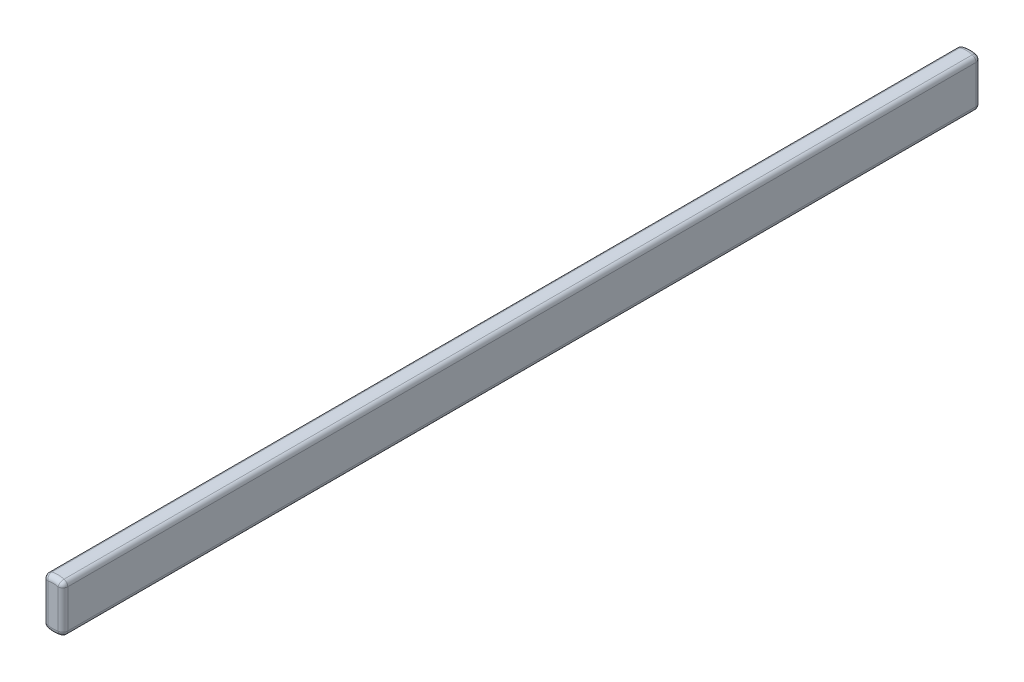
ISO-10303-21;
HEADER;
FILE_DESCRIPTION(('STEP AP214'),'2;1');
FILE_NAME('part.step','',(''),(''),'','','');
FILE_SCHEMA(('AUTOMOTIVE_DESIGN { 1 0 10303 214 1 1 1 1 }'));
ENDSEC;
DATA;
#1=APPLICATION_CONTEXT('core data for automotive mechanical design processes');
#2=APPLICATION_PROTOCOL_DEFINITION('international standard','automotive_design',2000,#1);
#3=PRODUCT_CONTEXT('',#1,'mechanical');
#4=PRODUCT('Part','Part','',(#3));
#5=PRODUCT_RELATED_PRODUCT_CATEGORY('part','',(#4));
#6=PRODUCT_DEFINITION_FORMATION('','',#4);
#7=PRODUCT_DEFINITION_CONTEXT('part definition',#1,'design');
#8=PRODUCT_DEFINITION('design','',#6,#7);
#9=PRODUCT_DEFINITION_SHAPE('','',#8);
#10=(LENGTH_UNIT() NAMED_UNIT(*) SI_UNIT(.MILLI.,.METRE.));
#11=(NAMED_UNIT(*) PLANE_ANGLE_UNIT() SI_UNIT($,.RADIAN.));
#12=(NAMED_UNIT(*) SI_UNIT($,.STERADIAN.) SOLID_ANGLE_UNIT());
#13=UNCERTAINTY_MEASURE_WITH_UNIT(LENGTH_MEASURE(1.E-05),#10,'distance_accuracy_value','');
#14=(GEOMETRIC_REPRESENTATION_CONTEXT(3) GLOBAL_UNCERTAINTY_ASSIGNED_CONTEXT((#13)) GLOBAL_UNIT_ASSIGNED_CONTEXT((#10,
#11,#12)) REPRESENTATION_CONTEXT('',''));
#15=CARTESIAN_POINT('',(0.,0.,0.));
#16=DIRECTION('',(0.,0.,1.));
#17=DIRECTION('',(1.,0.,0.));
#18=AXIS2_PLACEMENT_3D('',#15,#16,#17);
#19=CARTESIAN_POINT('',(0.,0.,170.));
#20=DIRECTION('',(0.,0.,-1.));
#21=DIRECTION('',(-1.,0.,0.));
#22=AXIS2_PLACEMENT_3D('',#19,#20,#21);
#23=CYLINDRICAL_SURFACE('',#22,5.);
#24=CARTESIAN_POINT('',(0.,0.,177.));
#25=DIRECTION('',(0.,0.,1.));
#26=DIRECTION('',(1.,0.,0.));
#27=AXIS2_PLACEMENT_3D('',#24,#25,#26);
#28=CIRCLE('',#27,5.);
#29=CARTESIAN_POINT('',(1.25,-4.84122918275927,177.));
#30=VERTEX_POINT('',#29);
#31=CARTESIAN_POINT('',(-1.25,-4.84122918275927,177.));
#32=VERTEX_POINT('',#31);
#33=EDGE_CURVE('E199',#30,#32,#28,.F.);
#34=ORIENTED_EDGE('',*,*,#33,.T.);
#35=DIRECTION('',(0.,0.,-1.));
#36=VECTOR('',#35,1.);
#37=CARTESIAN_POINT('',(-1.25,-4.84122918275927,170.));
#38=LINE('',#37,#36);
#39=CARTESIAN_POINT('',(-1.25,-4.84122918275927,-7.00000000000001));
#40=VERTEX_POINT('',#39);
#41=EDGE_CURVE('E196',#32,#40,#38,.T.);
#42=ORIENTED_EDGE('',*,*,#41,.T.);
#43=CARTESIAN_POINT('',(0.,0.,-7.00000000000001));
#44=DIRECTION('',(0.,0.,-1.));
#45=DIRECTION('',(-1.,0.,0.));
#46=AXIS2_PLACEMENT_3D('',#43,#44,#45);
#47=CIRCLE('',#46,5.);
#48=CARTESIAN_POINT('',(1.25,-4.84122918275927,-7.00000000000001));
#49=VERTEX_POINT('',#48);
#50=EDGE_CURVE('E193',#40,#49,#47,.F.);
#51=ORIENTED_EDGE('',*,*,#50,.T.);
#52=DIRECTION('',(0.,0.,-1.));
#53=VECTOR('',#52,1.);
#54=CARTESIAN_POINT('',(1.25,-4.84122918275927,170.));
#55=LINE('',#54,#53);
#56=EDGE_CURVE('E190',#49,#30,#55,.F.);
#57=ORIENTED_EDGE('',*,*,#56,.T.);
#58=EDGE_LOOP('',(#34,#42,#51,#57));
#59=FACE_BOUND('',#58,.T.);
#60=ADVANCED_FACE('F39',(#59),#23,.T.);
#61=DIRECTION('',(0.,0.,-1.));
#62=VECTOR('',#61,1.);
#63=CARTESIAN_POINT('',(-1.25,4.84122918275927,170.));
#64=LINE('',#63,#62);
#65=CARTESIAN_POINT('',(-1.25,4.84122918275927,-7.00000000000001));
#66=VERTEX_POINT('',#65);
#67=CARTESIAN_POINT('',(-1.25,4.84122918275927,177.));
#68=VERTEX_POINT('',#67);
#69=EDGE_CURVE('E187',#66,#68,#64,.F.);
#70=ORIENTED_EDGE('',*,*,#69,.T.);
#71=CARTESIAN_POINT('',(0.,0.,177.));
#72=DIRECTION('',(0.,0.,1.));
#73=DIRECTION('',(1.,0.,0.));
#74=AXIS2_PLACEMENT_3D('',#71,#72,#73);
#75=CIRCLE('',#74,5.);
#76=CARTESIAN_POINT('',(1.25,4.84122918275927,177.));
#77=VERTEX_POINT('',#76);
#78=EDGE_CURVE('E203',#68,#77,#75,.F.);
#79=ORIENTED_EDGE('',*,*,#78,.T.);
#80=DIRECTION('',(0.,0.,-1.));
#81=VECTOR('',#80,1.);
#82=CARTESIAN_POINT('',(1.25,4.84122918275927,170.));
#83=LINE('',#82,#81);
#84=CARTESIAN_POINT('',(1.25,4.84122918275927,-7.00000000000001));
#85=VERTEX_POINT('',#84);
#86=EDGE_CURVE('E181',#77,#85,#83,.T.);
#87=ORIENTED_EDGE('',*,*,#86,.T.);
#88=CARTESIAN_POINT('',(0.,0.,-7.00000000000001));
#89=DIRECTION('',(0.,0.,-1.));
#90=DIRECTION('',(-1.,0.,0.));
#91=AXIS2_PLACEMENT_3D('',#88,#89,#90);
#92=CIRCLE('',#91,5.);
#93=EDGE_CURVE('E184',#85,#66,#92,.F.);
#94=ORIENTED_EDGE('',*,*,#93,.T.);
#95=EDGE_LOOP('',(#70,#79,#87,#94));
#96=FACE_BOUND('',#95,.T.);
#97=ADVANCED_FACE('F332',(#96),#23,.T.);
#98=CARTESIAN_POINT('',(2.,-4.58257569495584,-8.));
#99=DIRECTION('',(-1.,0.,0.));
#100=DIRECTION('',(0.,0.,1.));
#101=AXIS2_PLACEMENT_3D('',#98,#99,#100);
#102=PLANE('',#101);
#103=DIRECTION('',(0.,-1.,0.));
#104=VECTOR('',#103,1.);
#105=CARTESIAN_POINT('',(2.,4.58257569495584,-7.));
#106=LINE('',#105,#104);
#107=CARTESIAN_POINT('',(2.,-3.87298334620742,-7.));
#108=VERTEX_POINT('',#107);
#109=CARTESIAN_POINT('',(2.,3.87298334620742,-7.));
#110=VERTEX_POINT('',#109);
#111=EDGE_CURVE('E11',#108,#110,#106,.F.);
#112=ORIENTED_EDGE('',*,*,#111,.T.);
#113=DIRECTION('',(0.,0.,-1.));
#114=VECTOR('',#113,1.);
#115=CARTESIAN_POINT('',(2.,3.87298334620742,178.));
#116=LINE('',#115,#114);
#117=CARTESIAN_POINT('',(2.,3.87298334620742,177.));
#118=VERTEX_POINT('',#117);
#119=EDGE_CURVE('E64',#110,#118,#116,.F.);
#120=ORIENTED_EDGE('',*,*,#119,.T.);
#121=DIRECTION('',(0.,1.,0.));
#122=VECTOR('',#121,1.);
#123=CARTESIAN_POINT('',(2.,-4.58257569495584,177.));
#124=LINE('',#123,#122);
#125=CARTESIAN_POINT('',(2.,-3.87298334620742,177.));
#126=VERTEX_POINT('',#125);
#127=EDGE_CURVE('E138',#118,#126,#124,.F.);
#128=ORIENTED_EDGE('',*,*,#127,.T.);
#129=DIRECTION('',(0.,0.,-1.));
#130=VECTOR('',#129,1.);
#131=CARTESIAN_POINT('',(2.,-3.87298334620742,178.));
#132=LINE('',#131,#130);
#133=EDGE_CURVE('E56',#126,#108,#132,.T.);
#134=ORIENTED_EDGE('',*,*,#133,.T.);
#135=EDGE_LOOP('',(#112,#120,#128,#134));
#136=FACE_BOUND('',#135,.T.);
#137=ADVANCED_FACE('F328',(#136),#102,.F.);
#138=CARTESIAN_POINT('',(-2.,-4.58257569495584,-8.));
#139=DIRECTION('',(1.,0.,0.));
#140=DIRECTION('',(0.,1.,0.));
#141=AXIS2_PLACEMENT_3D('',#138,#139,#140);
#142=PLANE('',#141);
#143=DIRECTION('',(0.,1.,0.));
#144=VECTOR('',#143,1.);
#145=CARTESIAN_POINT('',(-2.,-4.58257569495584,-7.));
#146=LINE('',#145,#144);
#147=CARTESIAN_POINT('',(-2.,3.87298334620742,-7.));
#148=VERTEX_POINT('',#147);
#149=CARTESIAN_POINT('',(-2.,-3.87298334620742,-7.));
#150=VERTEX_POINT('',#149);
#151=EDGE_CURVE('E49',#148,#150,#146,.F.);
#152=ORIENTED_EDGE('',*,*,#151,.T.);
#153=DIRECTION('',(0.,0.,-1.));
#154=VECTOR('',#153,1.);
#155=CARTESIAN_POINT('',(-2.,-3.87298334620742,178.));
#156=LINE('',#155,#154);
#157=CARTESIAN_POINT('',(-2.,-3.87298334620742,177.));
#158=VERTEX_POINT('',#157);
#159=EDGE_CURVE('E213',#150,#158,#156,.F.);
#160=ORIENTED_EDGE('',*,*,#159,.T.);
#161=DIRECTION('',(0.,-1.,0.));
#162=VECTOR('',#161,1.);
#163=CARTESIAN_POINT('',(-2.,4.58257569495584,177.));
#164=LINE('',#163,#162);
#165=CARTESIAN_POINT('',(-2.,3.87298334620742,177.));
#166=VERTEX_POINT('',#165);
#167=EDGE_CURVE('E210',#158,#166,#164,.F.);
#168=ORIENTED_EDGE('',*,*,#167,.T.);
#169=DIRECTION('',(0.,0.,-1.));
#170=VECTOR('',#169,1.);
#171=CARTESIAN_POINT('',(-2.,3.87298334620742,178.));
#172=LINE('',#171,#170);
#173=EDGE_CURVE('E207',#166,#148,#172,.T.);
#174=ORIENTED_EDGE('',*,*,#173,.T.);
#175=EDGE_LOOP('',(#152,#160,#168,#174));
#176=FACE_BOUND('',#175,.T.);
#177=ADVANCED_FACE('F487',(#176),#142,.F.);
#178=CARTESIAN_POINT('',(0.,0.,-8.));
#179=DIRECTION('',(0.,0.,-1.));
#180=DIRECTION('',(-1.,0.,0.));
#181=AXIS2_PLACEMENT_3D('',#178,#179,#180);
#182=PLANE('',#181);
#183=CARTESIAN_POINT('',(0.,0.,-8.));
#184=DIRECTION('',(0.,0.,-1.));
#185=DIRECTION('',(-1.,0.,0.));
#186=AXIS2_PLACEMENT_3D('',#183,#184,#185);
#187=CIRCLE('',#186,4.);
#188=CARTESIAN_POINT('',(1.,-3.87298334620742,-8.));
#189=VERTEX_POINT('',#188);
#190=CARTESIAN_POINT('',(-1.,-3.87298334620742,-8.));
#191=VERTEX_POINT('',#190);
#192=EDGE_CURVE('E222',#189,#191,#187,.T.);
#193=ORIENTED_EDGE('',*,*,#192,.T.);
#194=DIRECTION('',(0.,1.,0.));
#195=VECTOR('',#194,1.);
#196=CARTESIAN_POINT('',(-1.,4.58257569495584,-8.));
#197=LINE('',#196,#195);
#198=CARTESIAN_POINT('',(-1.,3.87298334620742,-8.));
#199=VERTEX_POINT('',#198);
#200=EDGE_CURVE('E225',#191,#199,#197,.T.);
#201=ORIENTED_EDGE('',*,*,#200,.T.);
#202=CARTESIAN_POINT('',(0.,0.,-8.));
#203=DIRECTION('',(0.,0.,-1.));
#204=DIRECTION('',(-1.,0.,0.));
#205=AXIS2_PLACEMENT_3D('',#202,#203,#204);
#206=CIRCLE('',#205,4.);
#207=CARTESIAN_POINT('',(1.,3.87298334620742,-8.));
#208=VERTEX_POINT('',#207);
#209=EDGE_CURVE('E216',#199,#208,#206,.T.);
#210=ORIENTED_EDGE('',*,*,#209,.T.);
#211=DIRECTION('',(0.,-1.,0.));
#212=VECTOR('',#211,1.);
#213=CARTESIAN_POINT('',(1.,-4.58257569495584,-8.));
#214=LINE('',#213,#212);
#215=EDGE_CURVE('E219',#208,#189,#214,.T.);
#216=ORIENTED_EDGE('',*,*,#215,.T.);
#217=EDGE_LOOP('',(#193,#201,#210,#216));
#218=FACE_BOUND('',#217,.T.);
#219=ADVANCED_FACE('F322',(#218),#182,.T.);
#220=CARTESIAN_POINT('',(0.,0.,178.));
#221=DIRECTION('',(0.,0.,1.));
#222=DIRECTION('',(1.,0.,0.));
#223=AXIS2_PLACEMENT_3D('',#220,#221,#222);
#224=PLANE('',#223);
#225=CARTESIAN_POINT('',(0.,0.,178.));
#226=DIRECTION('',(0.,0.,1.));
#227=DIRECTION('',(1.,0.,0.));
#228=AXIS2_PLACEMENT_3D('',#225,#226,#227);
#229=CIRCLE('',#228,4.);
#230=CARTESIAN_POINT('',(-1.,-3.87298334620742,178.));
#231=VERTEX_POINT('',#230);
#232=CARTESIAN_POINT('',(1.,-3.87298334620742,178.));
#233=VERTEX_POINT('',#232);
#234=EDGE_CURVE('E167',#231,#233,#229,.T.);
#235=ORIENTED_EDGE('',*,*,#234,.T.);
#236=DIRECTION('',(0.,1.,0.));
#237=VECTOR('',#236,1.);
#238=CARTESIAN_POINT('',(1.,4.58257569495584,178.));
#239=LINE('',#238,#237);
#240=CARTESIAN_POINT('',(1.,3.87298334620742,178.));
#241=VERTEX_POINT('',#240);
#242=EDGE_CURVE('E137',#233,#241,#239,.T.);
#243=ORIENTED_EDGE('',*,*,#242,.T.);
#244=CARTESIAN_POINT('',(0.,0.,178.));
#245=DIRECTION('',(0.,0.,1.));
#246=DIRECTION('',(1.,0.,0.));
#247=AXIS2_PLACEMENT_3D('',#244,#245,#246);
#248=CIRCLE('',#247,4.);
#249=CARTESIAN_POINT('',(-1.,3.87298334620742,178.));
#250=VERTEX_POINT('',#249);
#251=EDGE_CURVE('E155',#241,#250,#248,.T.);
#252=ORIENTED_EDGE('',*,*,#251,.T.);
#253=DIRECTION('',(0.,-1.,0.));
#254=VECTOR('',#253,1.);
#255=CARTESIAN_POINT('',(-1.,-4.58257569495584,178.));
#256=LINE('',#255,#254);
#257=EDGE_CURVE('E162',#250,#231,#256,.T.);
#258=ORIENTED_EDGE('',*,*,#257,.T.);
#259=EDGE_LOOP('',(#235,#243,#252,#258));
#260=FACE_BOUND('',#259,.T.);
#261=ADVANCED_FACE('F165',(#260),#224,.T.);
#262=CARTESIAN_POINT('',(-1.,-3.87298334620742,170.));
#263=DIRECTION('',(0.,0.,-1.));
#264=DIRECTION('',(-1.,0.,0.));
#265=AXIS2_PLACEMENT_3D('',#262,#263,#264);
#266=CYLINDRICAL_SURFACE('',#265,1.);
#267=ORIENTED_EDGE('',*,*,#159,.F.);
#268=CARTESIAN_POINT('',(-1.,-3.87298334620742,-7.00000000000001));
#269=DIRECTION('',(0.,0.,-1.));
#270=DIRECTION('',(-1.,0.,0.));
#271=AXIS2_PLACEMENT_3D('',#268,#269,#270);
#272=CIRCLE('',#271,1.);
#273=EDGE_CURVE('E283',#40,#150,#272,.T.);
#274=ORIENTED_EDGE('',*,*,#273,.F.);
#275=ORIENTED_EDGE('',*,*,#41,.F.);
#276=CARTESIAN_POINT('',(-1.,-3.87298334620742,177.));
#277=DIRECTION('',(0.,0.,1.));
#278=DIRECTION('',(1.,0.,0.));
#279=AXIS2_PLACEMENT_3D('',#276,#277,#278);
#280=CIRCLE('',#279,1.);
#281=EDGE_CURVE('E163',#158,#32,#280,.T.);
#282=ORIENTED_EDGE('',*,*,#281,.F.);
#283=EDGE_LOOP('',(#267,#274,#275,#282));
#284=FACE_BOUND('',#283,.T.);
#285=ADVANCED_FACE('F503',(#284),#266,.T.);
#286=CARTESIAN_POINT('',(-1.,0.,177.));
#287=DIRECTION('',(0.,1.,0.));
#288=DIRECTION('',(0.,0.,1.));
#289=AXIS2_PLACEMENT_3D('',#286,#287,#288);
#290=CYLINDRICAL_SURFACE('',#289,1.);
#291=CARTESIAN_POINT('',(-1.,3.87298334620742,177.));
#292=DIRECTION('',(0.,1.,0.));
#293=DIRECTION('',(0.,0.,1.));
#294=AXIS2_PLACEMENT_3D('',#291,#292,#293);
#295=CIRCLE('',#294,1.);
#296=EDGE_CURVE('E253',#166,#250,#295,.T.);
#297=ORIENTED_EDGE('',*,*,#296,.F.);
#298=ORIENTED_EDGE('',*,*,#167,.F.);
#299=CARTESIAN_POINT('',(-1.,-3.87298334620742,177.));
#300=DIRECTION('',(0.,-1.,0.));
#301=DIRECTION('',(0.,0.,-1.));
#302=AXIS2_PLACEMENT_3D('',#299,#300,#301);
#303=CIRCLE('',#302,1.);
#304=EDGE_CURVE('E257',#231,#158,#303,.T.);
#305=ORIENTED_EDGE('',*,*,#304,.F.);
#306=ORIENTED_EDGE('',*,*,#257,.F.);
#307=EDGE_LOOP('',(#297,#298,#305,#306));
#308=FACE_BOUND('',#307,.T.);
#309=ADVANCED_FACE('F346',(#308),#290,.T.);
#310=CARTESIAN_POINT('',(-1.,3.87298334620742,170.));
#311=DIRECTION('',(0.,0.,-1.));
#312=DIRECTION('',(-1.,0.,0.));
#313=AXIS2_PLACEMENT_3D('',#310,#311,#312);
#314=CYLINDRICAL_SURFACE('',#313,1.);
#315=CARTESIAN_POINT('',(-1.,3.87298334620742,177.));
#316=DIRECTION('',(0.,0.,1.));
#317=DIRECTION('',(1.,0.,0.));
#318=AXIS2_PLACEMENT_3D('',#315,#316,#317);
#319=CIRCLE('',#318,1.);
#320=EDGE_CURVE('E249',#68,#166,#319,.T.);
#321=ORIENTED_EDGE('',*,*,#320,.F.);
#322=ORIENTED_EDGE('',*,*,#69,.F.);
#323=CARTESIAN_POINT('',(-1.,3.87298334620742,-7.));
#324=DIRECTION('',(0.,0.,-1.));
#325=DIRECTION('',(0.,1.,0.));
#326=AXIS2_PLACEMENT_3D('',#323,#324,#325);
#327=CIRCLE('',#326,1.);
#328=EDGE_CURVE('E271',#148,#66,#327,.T.);
#329=ORIENTED_EDGE('',*,*,#328,.F.);
#330=ORIENTED_EDGE('',*,*,#173,.F.);
#331=EDGE_LOOP('',(#321,#322,#329,#330));
#332=FACE_BOUND('',#331,.T.);
#333=ADVANCED_FACE('F340',(#332),#314,.T.);
#334=CARTESIAN_POINT('',(-1.,-3.87298334620742,177.));
#335=DIRECTION('',(0.,0.,1.));
#336=DIRECTION('',(1.,0.,0.));
#337=AXIS2_PLACEMENT_3D('',#334,#335,#336);
#338=SPHERICAL_SURFACE('',#337,1.);
#339=ORIENTED_EDGE('',*,*,#304,.T.);
#340=ORIENTED_EDGE('',*,*,#281,.T.);
#341=CARTESIAN_POINT('',(-1.,-3.87298334620742,177.));
#342=DIRECTION('',(-0.968245836551854,0.25,0.));
#343=DIRECTION('',(-0.25,-0.968245836551854,0.));
#344=AXIS2_PLACEMENT_3D('',#341,#342,#343);
#345=CIRCLE('',#344,1.);
#346=EDGE_CURVE('E245',#231,#32,#345,.F.);
#347=ORIENTED_EDGE('',*,*,#346,.F.);
#348=EDGE_LOOP('',(#339,#340,#347));
#349=FACE_BOUND('',#348,.T.);
#350=ADVANCED_FACE('F352',(#349),#338,.T.);
#351=CARTESIAN_POINT('',(-1.,3.87298334620742,177.));
#352=DIRECTION('',(0.,0.,1.));
#353=DIRECTION('',(1.,0.,0.));
#354=AXIS2_PLACEMENT_3D('',#351,#352,#353);
#355=SPHERICAL_SURFACE('',#354,1.);
#356=ORIENTED_EDGE('',*,*,#320,.T.);
#357=ORIENTED_EDGE('',*,*,#296,.T.);
#358=CARTESIAN_POINT('',(-1.,3.87298334620742,177.));
#359=DIRECTION('',(-0.968245836551854,-0.25,0.));
#360=DIRECTION('',(0.25,-0.968245836551854,0.));
#361=AXIS2_PLACEMENT_3D('',#358,#359,#360);
#362=CIRCLE('',#361,1.);
#363=EDGE_CURVE('E158',#68,#250,#362,.F.);
#364=ORIENTED_EDGE('',*,*,#363,.F.);
#365=EDGE_LOOP('',(#356,#357,#364));
#366=FACE_BOUND('',#365,.T.);
#367=ADVANCED_FACE('F343',(#366),#355,.T.);
#368=CARTESIAN_POINT('',(1.,-3.87298334620742,170.));
#369=DIRECTION('',(0.,0.,-1.));
#370=DIRECTION('',(-1.,0.,0.));
#371=AXIS2_PLACEMENT_3D('',#368,#369,#370);
#372=CYLINDRICAL_SURFACE('',#371,1.);
#373=CARTESIAN_POINT('',(1.,-3.87298334620742,177.));
#374=DIRECTION('',(0.,0.,1.));
#375=DIRECTION('',(1.,0.,0.));
#376=AXIS2_PLACEMENT_3D('',#373,#374,#375);
#377=CIRCLE('',#376,1.);
#378=EDGE_CURVE('E239',#30,#126,#377,.T.);
#379=ORIENTED_EDGE('',*,*,#378,.F.);
#380=ORIENTED_EDGE('',*,*,#56,.F.);
#381=CARTESIAN_POINT('',(1.,-3.87298334620742,-7.));
#382=DIRECTION('',(0.,0.,-1.));
#383=DIRECTION('',(0.,1.,0.));
#384=AXIS2_PLACEMENT_3D('',#381,#382,#383);
#385=CIRCLE('',#384,1.);
#386=EDGE_CURVE('E43',#108,#49,#385,.T.);
#387=ORIENTED_EDGE('',*,*,#386,.F.);
#388=ORIENTED_EDGE('',*,*,#133,.F.);
#389=EDGE_LOOP('',(#379,#380,#387,#388));
#390=FACE_BOUND('',#389,.T.);
#391=ADVANCED_FACE('F360',(#390),#372,.T.);
#392=CARTESIAN_POINT('',(0.,0.,177.));
#393=DIRECTION('',(0.,0.,1.));
#394=DIRECTION('',(1.,0.,0.));
#395=AXIS2_PLACEMENT_3D('',#392,#393,#394);
#396=TOROIDAL_SURFACE('',#395,4.,1.);
#397=ORIENTED_EDGE('',*,*,#346,.T.);
#398=ORIENTED_EDGE('',*,*,#33,.F.);
#399=CARTESIAN_POINT('',(1.,-3.87298334620742,177.));
#400=DIRECTION('',(0.968245836551854,0.25,0.));
#401=DIRECTION('',(-0.25,0.968245836551854,0.));
#402=AXIS2_PLACEMENT_3D('',#399,#400,#401);
#403=CIRCLE('',#402,1.);
#404=EDGE_CURVE('E152',#233,#30,#403,.T.);
#405=ORIENTED_EDGE('',*,*,#404,.F.);
#406=ORIENTED_EDGE('',*,*,#234,.F.);
#407=EDGE_LOOP('',(#397,#398,#405,#406));
#408=FACE_BOUND('',#407,.T.);
#409=ADVANCED_FACE('F355',(#408),#396,.T.);
#410=CARTESIAN_POINT('',(0.,0.,177.));
#411=DIRECTION('',(0.,0.,1.));
#412=DIRECTION('',(1.,0.,0.));
#413=AXIS2_PLACEMENT_3D('',#410,#411,#412);
#414=TOROIDAL_SURFACE('',#413,4.,1.);
#415=ORIENTED_EDGE('',*,*,#363,.T.);
#416=ORIENTED_EDGE('',*,*,#251,.F.);
#417=CARTESIAN_POINT('',(1.,3.87298334620742,177.));
#418=DIRECTION('',(0.968245836551854,-0.25,0.));
#419=DIRECTION('',(0.25,0.968245836551854,0.));
#420=AXIS2_PLACEMENT_3D('',#417,#418,#419);
#421=CIRCLE('',#420,1.);
#422=EDGE_CURVE('E145',#77,#241,#421,.T.);
#423=ORIENTED_EDGE('',*,*,#422,.F.);
#424=ORIENTED_EDGE('',*,*,#78,.F.);
#425=EDGE_LOOP('',(#415,#416,#423,#424));
#426=FACE_BOUND('',#425,.T.);
#427=ADVANCED_FACE('F156',(#426),#414,.T.);
#428=CARTESIAN_POINT('',(1.,3.87298334620742,170.));
#429=DIRECTION('',(0.,0.,-1.));
#430=DIRECTION('',(-1.,0.,0.));
#431=AXIS2_PLACEMENT_3D('',#428,#429,#430);
#432=CYLINDRICAL_SURFACE('',#431,1.);
#433=ORIENTED_EDGE('',*,*,#119,.F.);
#434=CARTESIAN_POINT('',(1.,3.87298334620742,-7.00000000000001));
#435=DIRECTION('',(0.,0.,-1.));
#436=DIRECTION('',(-1.,0.,0.));
#437=AXIS2_PLACEMENT_3D('',#434,#435,#436);
#438=CIRCLE('',#437,1.);
#439=EDGE_CURVE('E295',#85,#110,#438,.T.);
#440=ORIENTED_EDGE('',*,*,#439,.F.);
#441=ORIENTED_EDGE('',*,*,#86,.F.);
#442=CARTESIAN_POINT('',(1.,3.87298334620742,177.));
#443=DIRECTION('',(0.,0.,1.));
#444=DIRECTION('',(1.,0.,0.));
#445=AXIS2_PLACEMENT_3D('',#442,#443,#444);
#446=CIRCLE('',#445,1.);
#447=EDGE_CURVE('E148',#118,#77,#446,.T.);
#448=ORIENTED_EDGE('',*,*,#447,.F.);
#449=EDGE_LOOP('',(#433,#440,#441,#448));
#450=FACE_BOUND('',#449,.T.);
#451=ADVANCED_FACE('F329',(#450),#432,.T.);
#452=CARTESIAN_POINT('',(1.,-3.87298334620742,177.));
#453=DIRECTION('',(0.,0.,1.));
#454=DIRECTION('',(1.,0.,0.));
#455=AXIS2_PLACEMENT_3D('',#452,#453,#454);
#456=SPHERICAL_SURFACE('',#455,1.);
#457=ORIENTED_EDGE('',*,*,#404,.T.);
#458=ORIENTED_EDGE('',*,*,#378,.T.);
#459=CARTESIAN_POINT('',(1.,-3.87298334620742,177.));
#460=DIRECTION('',(0.,-1.,0.));
#461=DIRECTION('',(0.,0.,-1.));
#462=AXIS2_PLACEMENT_3D('',#459,#460,#461);
#463=CIRCLE('',#462,1.);
#464=EDGE_CURVE('E142',#233,#126,#463,.F.);
#465=ORIENTED_EDGE('',*,*,#464,.F.);
#466=EDGE_LOOP('',(#457,#458,#465));
#467=FACE_BOUND('',#466,.T.);
#468=ADVANCED_FACE('F359',(#467),#456,.T.);
#469=CARTESIAN_POINT('',(1.,3.87298334620742,177.));
#470=DIRECTION('',(0.,0.,1.));
#471=DIRECTION('',(1.,0.,0.));
#472=AXIS2_PLACEMENT_3D('',#469,#470,#471);
#473=SPHERICAL_SURFACE('',#472,1.);
#474=ORIENTED_EDGE('',*,*,#447,.T.);
#475=ORIENTED_EDGE('',*,*,#422,.T.);
#476=CARTESIAN_POINT('',(1.,3.87298334620742,177.));
#477=DIRECTION('',(0.,1.,0.));
#478=DIRECTION('',(0.,0.,1.));
#479=AXIS2_PLACEMENT_3D('',#476,#477,#478);
#480=CIRCLE('',#479,1.);
#481=EDGE_CURVE('E133',#118,#241,#480,.F.);
#482=ORIENTED_EDGE('',*,*,#481,.F.);
#483=EDGE_LOOP('',(#474,#475,#482));
#484=FACE_BOUND('',#483,.T.);
#485=ADVANCED_FACE('F147',(#484),#473,.T.);
#486=CARTESIAN_POINT('',(1.,0.,177.));
#487=DIRECTION('',(0.,-1.,0.));
#488=DIRECTION('',(0.,0.,-1.));
#489=AXIS2_PLACEMENT_3D('',#486,#487,#488);
#490=CYLINDRICAL_SURFACE('',#489,1.);
#491=ORIENTED_EDGE('',*,*,#464,.T.);
#492=ORIENTED_EDGE('',*,*,#127,.F.);
#493=ORIENTED_EDGE('',*,*,#481,.T.);
#494=ORIENTED_EDGE('',*,*,#242,.F.);
#495=EDGE_LOOP('',(#491,#492,#493,#494));
#496=FACE_BOUND('',#495,.T.);
#497=ADVANCED_FACE('F135',(#496),#490,.T.);
#498=CARTESIAN_POINT('',(1.,0.,-7.));
#499=DIRECTION('',(0.,1.,0.));
#500=DIRECTION('',(0.,0.,1.));
#501=AXIS2_PLACEMENT_3D('',#498,#499,#500);
#502=CYLINDRICAL_SURFACE('',#501,1.);
#503=CARTESIAN_POINT('',(1.,3.87298334620742,-7.));
#504=DIRECTION('',(0.,1.,0.));
#505=DIRECTION('',(0.,0.,1.));
#506=AXIS2_PLACEMENT_3D('',#503,#504,#505);
#507=CIRCLE('',#506,1.);
#508=EDGE_CURVE('E299',#110,#208,#507,.T.);
#509=ORIENTED_EDGE('',*,*,#508,.F.);
#510=ORIENTED_EDGE('',*,*,#111,.F.);
#511=CARTESIAN_POINT('',(1.,-3.87298334620742,-7.));
#512=DIRECTION('',(0.,-1.,0.));
#513=DIRECTION('',(0.,0.,-1.));
#514=AXIS2_PLACEMENT_3D('',#511,#512,#513);
#515=CIRCLE('',#514,1.);
#516=EDGE_CURVE('E302',#189,#108,#515,.T.);
#517=ORIENTED_EDGE('',*,*,#516,.F.);
#518=ORIENTED_EDGE('',*,*,#215,.F.);
#519=EDGE_LOOP('',(#509,#510,#517,#518));
#520=FACE_BOUND('',#519,.T.);
#521=ADVANCED_FACE('F41',(#520),#502,.T.);
#522=CARTESIAN_POINT('',(1.,-3.87298334620742,-7.));
#523=DIRECTION('',(0.,0.,1.));
#524=DIRECTION('',(1.,0.,0.));
#525=AXIS2_PLACEMENT_3D('',#522,#523,#524);
#526=SPHERICAL_SURFACE('',#525,1.);
#527=ORIENTED_EDGE('',*,*,#516,.T.);
#528=ORIENTED_EDGE('',*,*,#386,.T.);
#529=CARTESIAN_POINT('',(1.,-3.87298334620742,-7.00000000000001));
#530=DIRECTION('',(0.968245836551854,0.25,0.));
#531=DIRECTION('',(-0.25,0.968245836551854,0.));
#532=AXIS2_PLACEMENT_3D('',#529,#530,#531);
#533=CIRCLE('',#532,1.);
#534=EDGE_CURVE('E291',#189,#49,#533,.F.);
#535=ORIENTED_EDGE('',*,*,#534,.F.);
#536=EDGE_LOOP('',(#527,#528,#535));
#537=FACE_BOUND('',#536,.T.);
#538=ADVANCED_FACE('F311',(#537),#526,.T.);
#539=CARTESIAN_POINT('',(1.,3.87298334620742,-7.));
#540=DIRECTION('',(0.,0.,1.));
#541=DIRECTION('',(1.,0.,0.));
#542=AXIS2_PLACEMENT_3D('',#539,#540,#541);
#543=SPHERICAL_SURFACE('',#542,1.);
#544=ORIENTED_EDGE('',*,*,#439,.T.);
#545=ORIENTED_EDGE('',*,*,#508,.T.);
#546=CARTESIAN_POINT('',(1.,3.87298334620742,-7.));
#547=DIRECTION('',(0.968245836551854,-0.25,0.));
#548=DIRECTION('',(0.25,0.968245836551854,0.));
#549=AXIS2_PLACEMENT_3D('',#546,#547,#548);
#550=CIRCLE('',#549,1.);
#551=EDGE_CURVE('E287',#85,#208,#550,.F.);
#552=ORIENTED_EDGE('',*,*,#551,.F.);
#553=EDGE_LOOP('',(#544,#545,#552));
#554=FACE_BOUND('',#553,.T.);
#555=ADVANCED_FACE('F418',(#554),#543,.T.);
#556=CARTESIAN_POINT('',(0.,0.,-7.00000000000001));
#557=DIRECTION('',(0.,0.,-1.));
#558=DIRECTION('',(-1.,0.,0.));
#559=AXIS2_PLACEMENT_3D('',#556,#557,#558);
#560=TOROIDAL_SURFACE('',#559,4.,1.);
#561=ORIENTED_EDGE('',*,*,#534,.T.);
#562=ORIENTED_EDGE('',*,*,#50,.F.);
#563=CARTESIAN_POINT('',(-1.,-3.87298334620742,-7.));
#564=DIRECTION('',(-0.968245836551854,0.25,0.));
#565=DIRECTION('',(-0.25,-0.968245836551854,0.));
#566=AXIS2_PLACEMENT_3D('',#563,#564,#565);
#567=CIRCLE('',#566,1.);
#568=EDGE_CURVE('E279',#191,#40,#567,.T.);
#569=ORIENTED_EDGE('',*,*,#568,.F.);
#570=ORIENTED_EDGE('',*,*,#192,.F.);
#571=EDGE_LOOP('',(#561,#562,#569,#570));
#572=FACE_BOUND('',#571,.T.);
#573=ADVANCED_FACE('F317',(#572),#560,.T.);
#574=CARTESIAN_POINT('',(0.,0.,-7.00000000000001));
#575=DIRECTION('',(0.,0.,-1.));
#576=DIRECTION('',(-1.,0.,0.));
#577=AXIS2_PLACEMENT_3D('',#574,#575,#576);
#578=TOROIDAL_SURFACE('',#577,4.,1.);
#579=ORIENTED_EDGE('',*,*,#551,.T.);
#580=ORIENTED_EDGE('',*,*,#209,.F.);
#581=CARTESIAN_POINT('',(-1.,3.87298334620742,-7.00000000000001));
#582=DIRECTION('',(-0.968245836551854,-0.25,0.));
#583=DIRECTION('',(0.25,-0.968245836551854,0.));
#584=AXIS2_PLACEMENT_3D('',#581,#582,#583);
#585=CIRCLE('',#584,1.);
#586=EDGE_CURVE('E275',#66,#199,#585,.T.);
#587=ORIENTED_EDGE('',*,*,#586,.F.);
#588=ORIENTED_EDGE('',*,*,#93,.F.);
#589=EDGE_LOOP('',(#579,#580,#587,#588));
#590=FACE_BOUND('',#589,.T.);
#591=ADVANCED_FACE('F431',(#590),#578,.T.);
#592=CARTESIAN_POINT('',(-1.,-3.87298334620742,-7.));
#593=DIRECTION('',(0.,0.,1.));
#594=DIRECTION('',(1.,0.,0.));
#595=AXIS2_PLACEMENT_3D('',#592,#593,#594);
#596=SPHERICAL_SURFACE('',#595,1.);
#597=ORIENTED_EDGE('',*,*,#568,.T.);
#598=ORIENTED_EDGE('',*,*,#273,.T.);
#599=CARTESIAN_POINT('',(-1.,-3.87298334620742,-7.));
#600=DIRECTION('',(0.,-1.,0.));
#601=DIRECTION('',(0.,0.,-1.));
#602=AXIS2_PLACEMENT_3D('',#599,#600,#601);
#603=CIRCLE('',#602,1.);
#604=EDGE_CURVE('E267',#191,#150,#603,.F.);
#605=ORIENTED_EDGE('',*,*,#604,.F.);
#606=EDGE_LOOP('',(#597,#598,#605));
#607=FACE_BOUND('',#606,.T.);
#608=ADVANCED_FACE('F438',(#607),#596,.T.);
#609=CARTESIAN_POINT('',(-1.,3.87298334620742,-7.));
#610=DIRECTION('',(0.,0.,1.));
#611=DIRECTION('',(1.,0.,0.));
#612=AXIS2_PLACEMENT_3D('',#609,#610,#611);
#613=SPHERICAL_SURFACE('',#612,1.);
#614=ORIENTED_EDGE('',*,*,#328,.T.);
#615=ORIENTED_EDGE('',*,*,#586,.T.);
#616=CARTESIAN_POINT('',(-1.,3.87298334620742,-7.));
#617=DIRECTION('',(0.,1.,0.));
#618=DIRECTION('',(0.,0.,1.));
#619=AXIS2_PLACEMENT_3D('',#616,#617,#618);
#620=CIRCLE('',#619,1.);
#621=EDGE_CURVE('E264',#148,#199,#620,.F.);
#622=ORIENTED_EDGE('',*,*,#621,.F.);
#623=EDGE_LOOP('',(#614,#615,#622));
#624=FACE_BOUND('',#623,.T.);
#625=ADVANCED_FACE('F446',(#624),#613,.T.);
#626=CARTESIAN_POINT('',(-1.,0.,-7.));
#627=DIRECTION('',(0.,-1.,0.));
#628=DIRECTION('',(1.,0.,0.));
#629=AXIS2_PLACEMENT_3D('',#626,#627,#628);
#630=CYLINDRICAL_SURFACE('',#629,1.);
#631=ORIENTED_EDGE('',*,*,#604,.T.);
#632=ORIENTED_EDGE('',*,*,#151,.F.);
#633=ORIENTED_EDGE('',*,*,#621,.T.);
#634=ORIENTED_EDGE('',*,*,#200,.F.);
#635=EDGE_LOOP('',(#631,#632,#633,#634));
#636=FACE_BOUND('',#635,.T.);
#637=ADVANCED_FACE('F454',(#636),#630,.T.);
#638=CLOSED_SHELL('',(#60,#97,#137,#177,#219,#261,#285,#309,#333,#350,#367,#391,#409,#427,#451,
#468,#485,#497,#521,#538,#555,#573,#591,#608,#625,#637));
#639=MANIFOLD_SOLID_BREP('B2',#638);
#640=ADVANCED_BREP_SHAPE_REPRESENTATION('',(#18,#639),#14);
#641=SHAPE_DEFINITION_REPRESENTATION(#9,#640);
ENDSEC;
END-ISO-10303-21;
